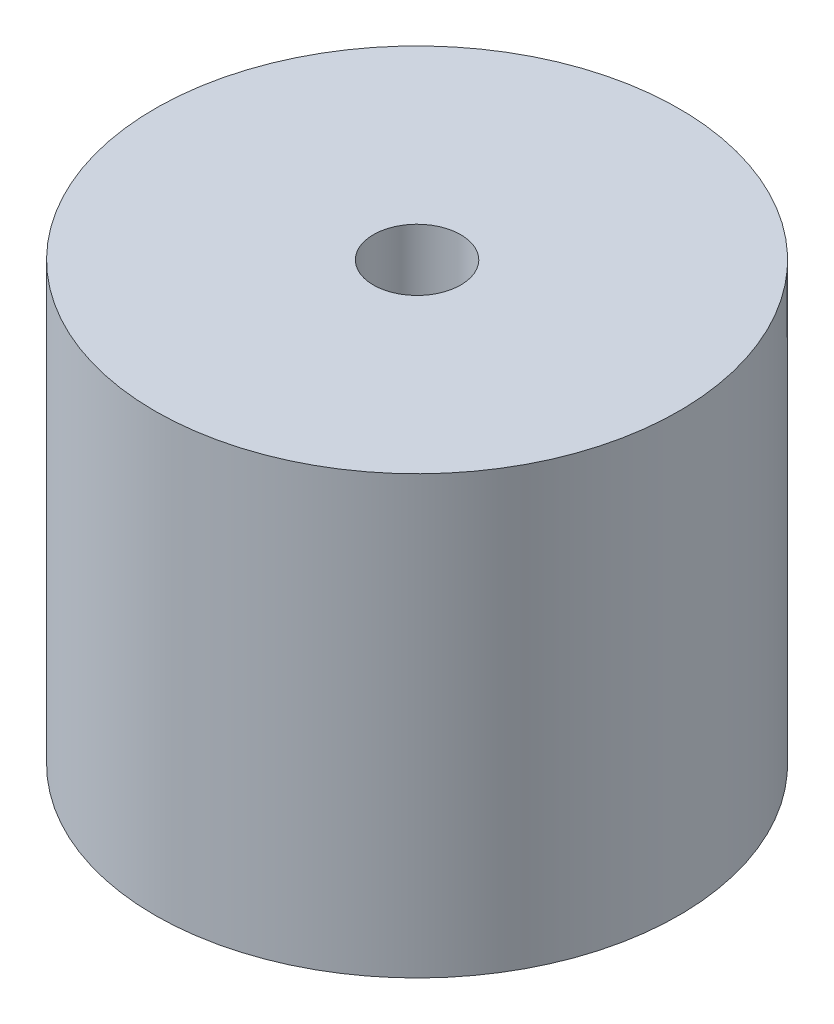
ISO-10303-21;
HEADER;
FILE_DESCRIPTION(('STEP AP214'),'2;1');
FILE_NAME('part.step','',(''),(''),'','','');
FILE_SCHEMA(('AUTOMOTIVE_DESIGN { 1 0 10303 214 1 1 1 1 }'));
ENDSEC;
DATA;
#1=APPLICATION_CONTEXT('core data for automotive mechanical design processes');
#2=APPLICATION_PROTOCOL_DEFINITION('international standard','automotive_design',2000,#1);
#3=PRODUCT_CONTEXT('',#1,'mechanical');
#4=PRODUCT('Part','Part','',(#3));
#5=PRODUCT_RELATED_PRODUCT_CATEGORY('part','',(#4));
#6=PRODUCT_DEFINITION_FORMATION('','',#4);
#7=PRODUCT_DEFINITION_CONTEXT('part definition',#1,'design');
#8=PRODUCT_DEFINITION('design','',#6,#7);
#9=PRODUCT_DEFINITION_SHAPE('','',#8);
#10=(LENGTH_UNIT() NAMED_UNIT(*) SI_UNIT(.MILLI.,.METRE.));
#11=(NAMED_UNIT(*) PLANE_ANGLE_UNIT() SI_UNIT($,.RADIAN.));
#12=(NAMED_UNIT(*) SI_UNIT($,.STERADIAN.) SOLID_ANGLE_UNIT());
#13=UNCERTAINTY_MEASURE_WITH_UNIT(LENGTH_MEASURE(1.E-05),#10,'distance_accuracy_value','');
#14=(GEOMETRIC_REPRESENTATION_CONTEXT(3) GLOBAL_UNCERTAINTY_ASSIGNED_CONTEXT((#13)) GLOBAL_UNIT_ASSIGNED_CONTEXT((#10,
#11,#12)) REPRESENTATION_CONTEXT('',''));
#15=CARTESIAN_POINT('',(0.,0.,0.));
#16=DIRECTION('',(0.,0.,1.));
#17=DIRECTION('',(1.,0.,0.));
#18=AXIS2_PLACEMENT_3D('',#15,#16,#17);
#19=CARTESIAN_POINT('',(0.,30.,0.));
#20=DIRECTION('',(0.,-1.,0.));
#21=DIRECTION('',(0.,0.,-1.));
#22=AXIS2_PLACEMENT_3D('',#19,#20,#21);
#23=CYLINDRICAL_SURFACE('',#22,18.);
#24=CARTESIAN_POINT('',(0.,30.,0.));
#25=DIRECTION('',(0.,1.,0.));
#26=DIRECTION('',(0.,0.,1.));
#27=AXIS2_PLACEMENT_3D('',#24,#25,#26);
#28=CIRCLE('',#27,18.);
#29=CARTESIAN_POINT('',(0.,30.,18.));
#30=VERTEX_POINT('',#29);
#31=EDGE_CURVE('E10',#30,#30,#28,.T.);
#32=ORIENTED_EDGE('',*,*,#31,.F.);
#33=EDGE_LOOP('',(#32));
#34=FACE_BOUND('',#33,.T.);
#35=CARTESIAN_POINT('',(0.,0.,0.));
#36=DIRECTION('',(0.,1.,0.));
#37=DIRECTION('',(0.,0.,1.));
#38=AXIS2_PLACEMENT_3D('',#35,#36,#37);
#39=CIRCLE('',#38,18.);
#40=CARTESIAN_POINT('',(0.,0.,18.));
#41=VERTEX_POINT('',#40);
#42=EDGE_CURVE('E40',#41,#41,#39,.T.);
#43=ORIENTED_EDGE('',*,*,#42,.T.);
#44=EDGE_LOOP('',(#43));
#45=FACE_BOUND('',#44,.T.);
#46=ADVANCED_FACE('F37',(#34,#45),#23,.T.);
#47=CARTESIAN_POINT('',(0.,30.,0.));
#48=DIRECTION('',(0.,1.,0.));
#49=DIRECTION('',(0.,0.,1.));
#50=AXIS2_PLACEMENT_3D('',#47,#48,#49);
#51=PLANE('',#50);
#52=CARTESIAN_POINT('',(0.,30.,0.));
#53=DIRECTION('',(0.,1.,0.));
#54=DIRECTION('',(0.,0.,1.));
#55=AXIS2_PLACEMENT_3D('',#52,#53,#54);
#56=CIRCLE('',#55,3.);
#57=CARTESIAN_POINT('',(0.,30.,3.));
#58=VERTEX_POINT('',#57);
#59=EDGE_CURVE('E51',#58,#58,#56,.T.);
#60=ORIENTED_EDGE('',*,*,#59,.F.);
#61=EDGE_LOOP('',(#60));
#62=FACE_BOUND('',#61,.T.);
#63=ORIENTED_EDGE('',*,*,#31,.T.);
#64=EDGE_LOOP('',(#63));
#65=FACE_BOUND('',#64,.T.);
#66=ADVANCED_FACE('F68',(#62,#65),#51,.T.);
#67=CARTESIAN_POINT('',(0.,0.,0.));
#68=DIRECTION('',(0.,1.,0.));
#69=DIRECTION('',(0.,0.,1.));
#70=AXIS2_PLACEMENT_3D('',#67,#68,#69);
#71=PLANE('',#70);
#72=CARTESIAN_POINT('',(0.,0.,0.));
#73=DIRECTION('',(0.,1.,0.));
#74=DIRECTION('',(0.,0.,1.));
#75=AXIS2_PLACEMENT_3D('',#72,#73,#74);
#76=CIRCLE('',#75,3.);
#77=CARTESIAN_POINT('',(0.,0.,3.));
#78=VERTEX_POINT('',#77);
#79=EDGE_CURVE('E49',#78,#78,#76,.T.);
#80=ORIENTED_EDGE('',*,*,#79,.T.);
#81=EDGE_LOOP('',(#80));
#82=FACE_BOUND('',#81,.T.);
#83=ORIENTED_EDGE('',*,*,#42,.F.);
#84=EDGE_LOOP('',(#83));
#85=FACE_BOUND('',#84,.T.);
#86=ADVANCED_FACE('F59',(#82,#85),#71,.F.);
#87=CARTESIAN_POINT('',(0.,0.,0.));
#88=DIRECTION('',(0.,1.,0.));
#89=DIRECTION('',(0.,0.,1.));
#90=AXIS2_PLACEMENT_3D('',#87,#88,#89);
#91=CYLINDRICAL_SURFACE('',#90,3.);
#92=ORIENTED_EDGE('',*,*,#79,.F.);
#93=EDGE_LOOP('',(#92));
#94=FACE_BOUND('',#93,.T.);
#95=ORIENTED_EDGE('',*,*,#59,.T.);
#96=EDGE_LOOP('',(#95));
#97=FACE_BOUND('',#96,.T.);
#98=ADVANCED_FACE('F62',(#94,#97),#91,.F.);
#99=CLOSED_SHELL('',(#46,#66,#86,#98));
#100=MANIFOLD_SOLID_BREP('B2',#99);
#101=ADVANCED_BREP_SHAPE_REPRESENTATION('',(#18,#100),#14);
#102=SHAPE_DEFINITION_REPRESENTATION(#9,#101);
ENDSEC;
END-ISO-10303-21;
